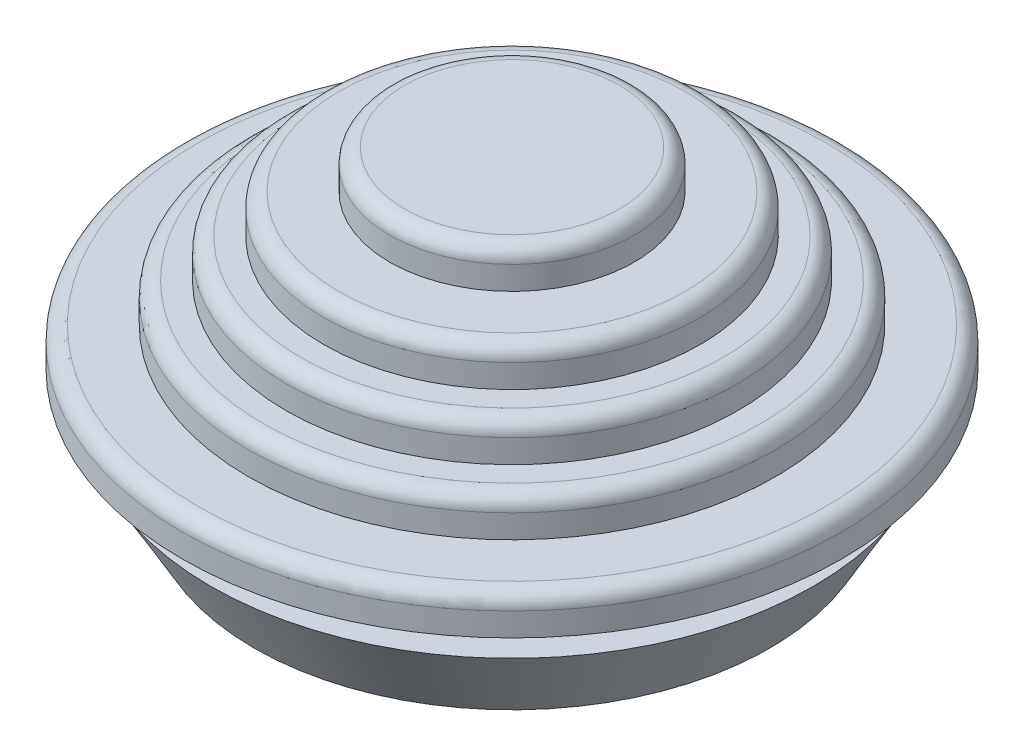
ISO-10303-21;
HEADER;
FILE_DESCRIPTION(('STEP AP214'),'2;1');
FILE_NAME('part.step','',(''),(''),'','','');
FILE_SCHEMA(('AUTOMOTIVE_DESIGN { 1 0 10303 214 1 1 1 1 }'));
ENDSEC;
DATA;
#1=APPLICATION_CONTEXT('core data for automotive mechanical design processes');
#2=APPLICATION_PROTOCOL_DEFINITION('international standard','automotive_design',2000,#1);
#3=PRODUCT_CONTEXT('',#1,'mechanical');
#4=PRODUCT('Part','Part','',(#3));
#5=PRODUCT_RELATED_PRODUCT_CATEGORY('part','',(#4));
#6=PRODUCT_DEFINITION_FORMATION('','',#4);
#7=PRODUCT_DEFINITION_CONTEXT('part definition',#1,'design');
#8=PRODUCT_DEFINITION('design','',#6,#7);
#9=PRODUCT_DEFINITION_SHAPE('','',#8);
#10=(LENGTH_UNIT() NAMED_UNIT(*) SI_UNIT(.MILLI.,.METRE.));
#11=(NAMED_UNIT(*) PLANE_ANGLE_UNIT() SI_UNIT($,.RADIAN.));
#12=(NAMED_UNIT(*) SI_UNIT($,.STERADIAN.) SOLID_ANGLE_UNIT());
#13=UNCERTAINTY_MEASURE_WITH_UNIT(LENGTH_MEASURE(1.E-05),#10,'distance_accuracy_value','');
#14=(GEOMETRIC_REPRESENTATION_CONTEXT(3) GLOBAL_UNCERTAINTY_ASSIGNED_CONTEXT((#13)) GLOBAL_UNIT_ASSIGNED_CONTEXT((#10,
#11,#12)) REPRESENTATION_CONTEXT('',''));
#15=CARTESIAN_POINT('',(0.,0.,0.));
#16=DIRECTION('',(0.,0.,1.));
#17=DIRECTION('',(1.,0.,0.));
#18=AXIS2_PLACEMENT_3D('',#15,#16,#17);
#19=CARTESIAN_POINT('',(0.,67.946967248786,0.));
#20=DIRECTION('',(0.,1.,0.));
#21=DIRECTION('',(0.,0.,1.));
#22=AXIS2_PLACEMENT_3D('',#19,#20,#21);
#23=CYLINDRICAL_SURFACE('',#22,12.4);
#24=CARTESIAN_POINT('',(0.,0.,0.));
#25=DIRECTION('',(0.,1.,0.));
#26=DIRECTION('',(0.,0.,1.));
#27=AXIS2_PLACEMENT_3D('',#24,#25,#26);
#28=CIRCLE('',#27,12.4);
#29=CARTESIAN_POINT('',(0.,0.,12.4));
#30=VERTEX_POINT('',#29);
#31=EDGE_CURVE('E113',#30,#30,#28,.T.);
#32=ORIENTED_EDGE('',*,*,#31,.F.);
#33=EDGE_LOOP('',(#32));
#34=FACE_BOUND('',#33,.T.);
#35=CARTESIAN_POINT('',(0.,8.08,0.));
#36=DIRECTION('',(0.,1.,0.));
#37=DIRECTION('',(0.,0.,1.));
#38=AXIS2_PLACEMENT_3D('',#35,#36,#37);
#39=CIRCLE('',#38,12.4);
#40=CARTESIAN_POINT('',(0.,8.08,12.4));
#41=VERTEX_POINT('',#40);
#42=EDGE_CURVE('E71',#41,#41,#39,.T.);
#43=ORIENTED_EDGE('',*,*,#42,.T.);
#44=EDGE_LOOP('',(#43));
#45=FACE_BOUND('',#44,.T.);
#46=ADVANCED_FACE('F33',(#34,#45),#23,.F.);
#47=CARTESIAN_POINT('',(10.,8.08,0.));
#48=DIRECTION('',(0.,1.,0.));
#49=DIRECTION('',(0.,0.,1.));
#50=AXIS2_PLACEMENT_3D('',#47,#48,#49);
#51=PLANE('',#50);
#52=ORIENTED_EDGE('',*,*,#42,.F.);
#53=EDGE_LOOP('',(#52));
#54=FACE_BOUND('',#53,.T.);
#55=CARTESIAN_POINT('',(0.,8.08,0.));
#56=DIRECTION('',(0.,1.,0.));
#57=DIRECTION('',(0.,0.,1.));
#58=AXIS2_PLACEMENT_3D('',#55,#56,#57);
#59=CIRCLE('',#58,10.);
#60=CARTESIAN_POINT('',(0.,8.08,10.));
#61=VERTEX_POINT('',#60);
#62=EDGE_CURVE('E74',#61,#61,#59,.T.);
#63=ORIENTED_EDGE('',*,*,#62,.T.);
#64=EDGE_LOOP('',(#63));
#65=FACE_BOUND('',#64,.T.);
#66=ADVANCED_FACE('F121',(#54,#65),#51,.F.);
#67=CARTESIAN_POINT('',(0.,67.946967248786,0.));
#68=DIRECTION('',(0.,1.,0.));
#69=DIRECTION('',(0.,0.,1.));
#70=AXIS2_PLACEMENT_3D('',#67,#68,#69);
#71=CYLINDRICAL_SURFACE('',#70,10.);
#72=ORIENTED_EDGE('',*,*,#62,.F.);
#73=EDGE_LOOP('',(#72));
#74=FACE_BOUND('',#73,.T.);
#75=CARTESIAN_POINT('',(0.,10.12,0.));
#76=DIRECTION('',(0.,1.,0.));
#77=DIRECTION('',(0.,0.,1.));
#78=AXIS2_PLACEMENT_3D('',#75,#76,#77);
#79=CIRCLE('',#78,10.);
#80=CARTESIAN_POINT('',(0.,10.12,10.));
#81=VERTEX_POINT('',#80);
#82=EDGE_CURVE('E77',#81,#81,#79,.T.);
#83=ORIENTED_EDGE('',*,*,#82,.T.);
#84=EDGE_LOOP('',(#83));
#85=FACE_BOUND('',#84,.T.);
#86=ADVANCED_FACE('F127',(#74,#85),#71,.F.);
#87=CARTESIAN_POINT('',(10.,10.12,0.));
#88=DIRECTION('',(0.,1.,0.));
#89=DIRECTION('',(0.,0.,1.));
#90=AXIS2_PLACEMENT_3D('',#87,#88,#89);
#91=PLANE('',#90);
#92=ORIENTED_EDGE('',*,*,#82,.F.);
#93=EDGE_LOOP('',(#92));
#94=FACE_BOUND('',#93,.T.);
#95=CARTESIAN_POINT('',(0.,10.12,0.));
#96=DIRECTION('',(0.,1.,0.));
#97=DIRECTION('',(0.,0.,1.));
#98=AXIS2_PLACEMENT_3D('',#95,#96,#97);
#99=CIRCLE('',#98,8.);
#100=CARTESIAN_POINT('',(0.,10.12,8.));
#101=VERTEX_POINT('',#100);
#102=EDGE_CURVE('E80',#101,#101,#99,.T.);
#103=ORIENTED_EDGE('',*,*,#102,.T.);
#104=EDGE_LOOP('',(#103));
#105=FACE_BOUND('',#104,.T.);
#106=ADVANCED_FACE('F133',(#94,#105),#91,.F.);
#107=CARTESIAN_POINT('',(0.,67.946967248786,0.));
#108=DIRECTION('',(0.,1.,0.));
#109=DIRECTION('',(0.,0.,1.));
#110=AXIS2_PLACEMENT_3D('',#107,#108,#109);
#111=CYLINDRICAL_SURFACE('',#110,8.);
#112=ORIENTED_EDGE('',*,*,#102,.F.);
#113=EDGE_LOOP('',(#112));
#114=FACE_BOUND('',#113,.T.);
#115=CARTESIAN_POINT('',(0.,12.16,0.));
#116=DIRECTION('',(0.,1.,0.));
#117=DIRECTION('',(0.,0.,1.));
#118=AXIS2_PLACEMENT_3D('',#115,#116,#117);
#119=CIRCLE('',#118,8.);
#120=CARTESIAN_POINT('',(0.,12.16,8.));
#121=VERTEX_POINT('',#120);
#122=EDGE_CURVE('E83',#121,#121,#119,.T.);
#123=ORIENTED_EDGE('',*,*,#122,.T.);
#124=EDGE_LOOP('',(#123));
#125=FACE_BOUND('',#124,.T.);
#126=ADVANCED_FACE('F139',(#114,#125),#111,.F.);
#127=CARTESIAN_POINT('',(8.,12.16,0.));
#128=DIRECTION('',(0.,1.,0.));
#129=DIRECTION('',(0.,0.,1.));
#130=AXIS2_PLACEMENT_3D('',#127,#128,#129);
#131=PLANE('',#130);
#132=ORIENTED_EDGE('',*,*,#122,.F.);
#133=EDGE_LOOP('',(#132));
#134=FACE_BOUND('',#133,.T.);
#135=ADVANCED_FACE('F145',(#134),#131,.F.);
#136=CARTESIAN_POINT('',(6.5,16.2,0.));
#137=DIRECTION('',(0.,-1.,0.));
#138=DIRECTION('',(0.,0.,-1.));
#139=AXIS2_PLACEMENT_3D('',#136,#137,#138);
#140=PLANE('',#139);
#141=CARTESIAN_POINT('',(0.,16.2,0.));
#142=DIRECTION('',(0.,-1.,0.));
#143=DIRECTION('',(0.,0.,-1.));
#144=AXIS2_PLACEMENT_3D('',#141,#142,#143);
#145=CIRCLE('',#144,5.7);
#146=CARTESIAN_POINT('',(0.,16.2,-5.7));
#147=VERTEX_POINT('',#146);
#148=EDGE_CURVE('E68',#147,#147,#145,.F.);
#149=ORIENTED_EDGE('',*,*,#148,.T.);
#150=EDGE_LOOP('',(#149));
#151=FACE_BOUND('',#150,.T.);
#152=ADVANCED_FACE('F150',(#151),#140,.F.);
#153=CARTESIAN_POINT('',(0.,67.946967248786,0.));
#154=DIRECTION('',(0.,1.,0.));
#155=DIRECTION('',(0.,0.,1.));
#156=AXIS2_PLACEMENT_3D('',#153,#154,#155);
#157=CYLINDRICAL_SURFACE('',#156,6.5);
#158=CARTESIAN_POINT('',(0.,15.4,0.));
#159=DIRECTION('',(0.,-1.,0.));
#160=DIRECTION('',(0.,0.,-1.));
#161=AXIS2_PLACEMENT_3D('',#158,#159,#160);
#162=CIRCLE('',#161,6.5);
#163=CARTESIAN_POINT('',(0.,15.4,-6.5));
#164=VERTEX_POINT('',#163);
#165=EDGE_CURVE('E65',#164,#164,#162,.T.);
#166=ORIENTED_EDGE('',*,*,#165,.T.);
#167=EDGE_LOOP('',(#166));
#168=FACE_BOUND('',#167,.T.);
#169=CARTESIAN_POINT('',(0.,14.16,0.));
#170=DIRECTION('',(0.,1.,0.));
#171=DIRECTION('',(0.,0.,1.));
#172=AXIS2_PLACEMENT_3D('',#169,#170,#171);
#173=CIRCLE('',#172,6.5);
#174=CARTESIAN_POINT('',(0.,14.16,6.5));
#175=VERTEX_POINT('',#174);
#176=EDGE_CURVE('E86',#175,#175,#173,.T.);
#177=ORIENTED_EDGE('',*,*,#176,.T.);
#178=EDGE_LOOP('',(#177));
#179=FACE_BOUND('',#178,.T.);
#180=ADVANCED_FACE('F155',(#168,#179),#157,.T.);
#181=CARTESIAN_POINT('',(10.,14.16,0.));
#182=DIRECTION('',(0.,-1.,0.));
#183=DIRECTION('',(0.,0.,-1.));
#184=AXIS2_PLACEMENT_3D('',#181,#182,#183);
#185=PLANE('',#184);
#186=CARTESIAN_POINT('',(0.,14.16,0.));
#187=DIRECTION('',(0.,-1.,0.));
#188=DIRECTION('',(0.,0.,-1.));
#189=AXIS2_PLACEMENT_3D('',#186,#187,#188);
#190=CIRCLE('',#189,9.2);
#191=CARTESIAN_POINT('',(0.,14.16,-9.2));
#192=VERTEX_POINT('',#191);
#193=EDGE_CURVE('E62',#192,#192,#190,.F.);
#194=ORIENTED_EDGE('',*,*,#193,.T.);
#195=EDGE_LOOP('',(#194));
#196=FACE_BOUND('',#195,.T.);
#197=ORIENTED_EDGE('',*,*,#176,.F.);
#198=EDGE_LOOP('',(#197));
#199=FACE_BOUND('',#198,.T.);
#200=ADVANCED_FACE('F204',(#196,#199),#185,.F.);
#201=CARTESIAN_POINT('',(0.,67.946967248786,0.));
#202=DIRECTION('',(0.,1.,0.));
#203=DIRECTION('',(0.,0.,1.));
#204=AXIS2_PLACEMENT_3D('',#201,#202,#203);
#205=CYLINDRICAL_SURFACE('',#204,10.);
#206=CARTESIAN_POINT('',(0.,13.36,0.));
#207=DIRECTION('',(0.,-1.,0.));
#208=DIRECTION('',(0.,0.,-1.));
#209=AXIS2_PLACEMENT_3D('',#206,#207,#208);
#210=CIRCLE('',#209,10.);
#211=CARTESIAN_POINT('',(0.,13.36,-10.));
#212=VERTEX_POINT('',#211);
#213=EDGE_CURVE('E59',#212,#212,#210,.T.);
#214=ORIENTED_EDGE('',*,*,#213,.T.);
#215=EDGE_LOOP('',(#214));
#216=FACE_BOUND('',#215,.T.);
#217=CARTESIAN_POINT('',(0.,12.12,0.));
#218=DIRECTION('',(0.,1.,0.));
#219=DIRECTION('',(0.,0.,1.));
#220=AXIS2_PLACEMENT_3D('',#217,#218,#219);
#221=CIRCLE('',#220,10.);
#222=CARTESIAN_POINT('',(0.,12.12,10.));
#223=VERTEX_POINT('',#222);
#224=EDGE_CURVE('E89',#223,#223,#221,.T.);
#225=ORIENTED_EDGE('',*,*,#224,.T.);
#226=EDGE_LOOP('',(#225));
#227=FACE_BOUND('',#226,.T.);
#228=ADVANCED_FACE('F197',(#216,#227),#205,.T.);
#229=CARTESIAN_POINT('',(12.,12.12,0.));
#230=DIRECTION('',(0.,-1.,0.));
#231=DIRECTION('',(0.,0.,-1.));
#232=AXIS2_PLACEMENT_3D('',#229,#230,#231);
#233=PLANE('',#232);
#234=CARTESIAN_POINT('',(0.,12.12,0.));
#235=DIRECTION('',(0.,-1.,0.));
#236=DIRECTION('',(0.,0.,-1.));
#237=AXIS2_PLACEMENT_3D('',#234,#235,#236);
#238=CIRCLE('',#237,11.2);
#239=CARTESIAN_POINT('',(0.,12.12,-11.2));
#240=VERTEX_POINT('',#239);
#241=EDGE_CURVE('E56',#240,#240,#238,.F.);
#242=ORIENTED_EDGE('',*,*,#241,.T.);
#243=EDGE_LOOP('',(#242));
#244=FACE_BOUND('',#243,.T.);
#245=ORIENTED_EDGE('',*,*,#224,.F.);
#246=EDGE_LOOP('',(#245));
#247=FACE_BOUND('',#246,.T.);
#248=ADVANCED_FACE('F191',(#244,#247),#233,.F.);
#249=CARTESIAN_POINT('',(0.,67.946967248786,0.));
#250=DIRECTION('',(0.,1.,0.));
#251=DIRECTION('',(0.,0.,1.));
#252=AXIS2_PLACEMENT_3D('',#249,#250,#251);
#253=CYLINDRICAL_SURFACE('',#252,12.);
#254=CARTESIAN_POINT('',(0.,11.32,0.));
#255=DIRECTION('',(0.,-1.,0.));
#256=DIRECTION('',(0.,0.,-1.));
#257=AXIS2_PLACEMENT_3D('',#254,#255,#256);
#258=CIRCLE('',#257,12.);
#259=CARTESIAN_POINT('',(0.,11.32,-12.));
#260=VERTEX_POINT('',#259);
#261=EDGE_CURVE('E53',#260,#260,#258,.T.);
#262=ORIENTED_EDGE('',*,*,#261,.T.);
#263=EDGE_LOOP('',(#262));
#264=FACE_BOUND('',#263,.T.);
#265=CARTESIAN_POINT('',(0.,10.08,0.));
#266=DIRECTION('',(0.,1.,0.));
#267=DIRECTION('',(0.,0.,1.));
#268=AXIS2_PLACEMENT_3D('',#265,#266,#267);
#269=CIRCLE('',#268,12.);
#270=CARTESIAN_POINT('',(0.,10.08,12.));
#271=VERTEX_POINT('',#270);
#272=EDGE_CURVE('E92',#271,#271,#269,.T.);
#273=ORIENTED_EDGE('',*,*,#272,.T.);
#274=EDGE_LOOP('',(#273));
#275=FACE_BOUND('',#274,.T.);
#276=ADVANCED_FACE('F186',(#264,#275),#253,.T.);
#277=CARTESIAN_POINT('',(14.,10.08,0.));
#278=DIRECTION('',(0.,-1.,0.));
#279=DIRECTION('',(0.,0.,-1.));
#280=AXIS2_PLACEMENT_3D('',#277,#278,#279);
#281=PLANE('',#280);
#282=CARTESIAN_POINT('',(0.,10.08,0.));
#283=DIRECTION('',(0.,-1.,0.));
#284=DIRECTION('',(0.,0.,-1.));
#285=AXIS2_PLACEMENT_3D('',#282,#283,#284);
#286=CIRCLE('',#285,13.2);
#287=CARTESIAN_POINT('',(0.,10.08,-13.2));
#288=VERTEX_POINT('',#287);
#289=EDGE_CURVE('E48',#288,#288,#286,.F.);
#290=ORIENTED_EDGE('',*,*,#289,.T.);
#291=EDGE_LOOP('',(#290));
#292=FACE_BOUND('',#291,.T.);
#293=ORIENTED_EDGE('',*,*,#272,.F.);
#294=EDGE_LOOP('',(#293));
#295=FACE_BOUND('',#294,.T.);
#296=ADVANCED_FACE('F182',(#292,#295),#281,.F.);
#297=CARTESIAN_POINT('',(0.,67.946967248786,0.));
#298=DIRECTION('',(0.,1.,0.));
#299=DIRECTION('',(0.,0.,1.));
#300=AXIS2_PLACEMENT_3D('',#297,#298,#299);
#301=CYLINDRICAL_SURFACE('',#300,14.);
#302=CARTESIAN_POINT('',(0.,9.28,0.));
#303=DIRECTION('',(0.,-1.,0.));
#304=DIRECTION('',(0.,0.,-1.));
#305=AXIS2_PLACEMENT_3D('',#302,#303,#304);
#306=CIRCLE('',#305,14.);
#307=CARTESIAN_POINT('',(0.,9.28,-14.));
#308=VERTEX_POINT('',#307);
#309=EDGE_CURVE('E44',#308,#308,#306,.T.);
#310=ORIENTED_EDGE('',*,*,#309,.T.);
#311=EDGE_LOOP('',(#310));
#312=FACE_BOUND('',#311,.T.);
#313=CARTESIAN_POINT('',(0.,8.04,0.));
#314=DIRECTION('',(0.,1.,0.));
#315=DIRECTION('',(0.,0.,1.));
#316=AXIS2_PLACEMENT_3D('',#313,#314,#315);
#317=CIRCLE('',#316,14.);
#318=CARTESIAN_POINT('',(0.,8.04,14.));
#319=VERTEX_POINT('',#318);
#320=EDGE_CURVE('E95',#319,#319,#317,.T.);
#321=ORIENTED_EDGE('',*,*,#320,.T.);
#322=EDGE_LOOP('',(#321));
#323=FACE_BOUND('',#322,.T.);
#324=ADVANCED_FACE('F185',(#312,#323),#301,.T.);
#325=CARTESIAN_POINT('',(17.5,8.04,0.));
#326=DIRECTION('',(0.,-1.,0.));
#327=DIRECTION('',(0.,0.,-1.));
#328=AXIS2_PLACEMENT_3D('',#325,#326,#327);
#329=PLANE('',#328);
#330=CARTESIAN_POINT('',(0.,8.04,0.));
#331=DIRECTION('',(0.,-1.,0.));
#332=DIRECTION('',(0.,0.,-1.));
#333=AXIS2_PLACEMENT_3D('',#330,#331,#332);
#334=CIRCLE('',#333,16.7);
#335=CARTESIAN_POINT('',(0.,8.04,-16.7));
#336=VERTEX_POINT('',#335);
#337=EDGE_CURVE('E40',#336,#336,#334,.F.);
#338=ORIENTED_EDGE('',*,*,#337,.T.);
#339=EDGE_LOOP('',(#338));
#340=FACE_BOUND('',#339,.T.);
#341=ORIENTED_EDGE('',*,*,#320,.F.);
#342=EDGE_LOOP('',(#341));
#343=FACE_BOUND('',#342,.T.);
#344=ADVANCED_FACE('F251',(#340,#343),#329,.F.);
#345=CARTESIAN_POINT('',(0.,67.946967248786,0.));
#346=DIRECTION('',(0.,1.,0.));
#347=DIRECTION('',(0.,0.,1.));
#348=AXIS2_PLACEMENT_3D('',#345,#346,#347);
#349=CYLINDRICAL_SURFACE('',#348,17.5);
#350=CARTESIAN_POINT('',(0.,7.24,0.));
#351=DIRECTION('',(0.,-1.,0.));
#352=DIRECTION('',(0.,0.,-1.));
#353=AXIS2_PLACEMENT_3D('',#350,#351,#352);
#354=CIRCLE('',#353,17.5);
#355=CARTESIAN_POINT('',(0.,7.24,-17.5));
#356=VERTEX_POINT('',#355);
#357=EDGE_CURVE('E10',#356,#356,#354,.T.);
#358=ORIENTED_EDGE('',*,*,#357,.T.);
#359=EDGE_LOOP('',(#358));
#360=FACE_BOUND('',#359,.T.);
#361=CARTESIAN_POINT('',(0.,6.,0.));
#362=DIRECTION('',(0.,1.,0.));
#363=DIRECTION('',(0.,0.,1.));
#364=AXIS2_PLACEMENT_3D('',#361,#362,#363);
#365=CIRCLE('',#364,17.5);
#366=CARTESIAN_POINT('',(0.,6.,17.5));
#367=VERTEX_POINT('',#366);
#368=EDGE_CURVE('E98',#367,#367,#365,.T.);
#369=ORIENTED_EDGE('',*,*,#368,.T.);
#370=EDGE_LOOP('',(#369));
#371=FACE_BOUND('',#370,.T.);
#372=ADVANCED_FACE('F260',(#360,#371),#349,.T.);
#373=CARTESIAN_POINT('',(14.5,6.,0.));
#374=DIRECTION('',(0.,1.,0.));
#375=DIRECTION('',(0.,0.,1.));
#376=AXIS2_PLACEMENT_3D('',#373,#374,#375);
#377=PLANE('',#376);
#378=ORIENTED_EDGE('',*,*,#368,.F.);
#379=EDGE_LOOP('',(#378));
#380=FACE_BOUND('',#379,.T.);
#381=CARTESIAN_POINT('',(0.,6.,0.));
#382=DIRECTION('',(0.,1.,0.));
#383=DIRECTION('',(0.,0.,1.));
#384=AXIS2_PLACEMENT_3D('',#381,#382,#383);
#385=CIRCLE('',#384,14.5);
#386=CARTESIAN_POINT('',(0.,6.,14.5));
#387=VERTEX_POINT('',#386);
#388=EDGE_CURVE('E101',#387,#387,#385,.T.);
#389=ORIENTED_EDGE('',*,*,#388,.T.);
#390=EDGE_LOOP('',(#389));
#391=FACE_BOUND('',#390,.T.);
#392=ADVANCED_FACE('F269',(#380,#391),#377,.F.);
#393=CARTESIAN_POINT('',(0.,67.946967248786,0.));
#394=DIRECTION('',(0.,1.,0.));
#395=DIRECTION('',(0.,0.,1.));
#396=AXIS2_PLACEMENT_3D('',#393,#394,#395);
#397=CYLINDRICAL_SURFACE('',#396,14.5);
#398=ORIENTED_EDGE('',*,*,#388,.F.);
#399=EDGE_LOOP('',(#398));
#400=FACE_BOUND('',#399,.T.);
#401=CARTESIAN_POINT('',(0.,3.99999999999999,0.));
#402=DIRECTION('',(0.,1.,0.));
#403=DIRECTION('',(0.,0.,1.));
#404=AXIS2_PLACEMENT_3D('',#401,#402,#403);
#405=CIRCLE('',#404,14.5);
#406=CARTESIAN_POINT('',(0.,3.99999999999999,14.5));
#407=VERTEX_POINT('',#406);
#408=EDGE_CURVE('E104',#407,#407,#405,.T.);
#409=ORIENTED_EDGE('',*,*,#408,.T.);
#410=EDGE_LOOP('',(#409));
#411=FACE_BOUND('',#410,.T.);
#412=ADVANCED_FACE('F323',(#400,#411),#397,.T.);
#413=CARTESIAN_POINT('',(16.,4.,0.));
#414=DIRECTION('',(0.,-1.,0.));
#415=DIRECTION('',(0.,0.,-1.));
#416=AXIS2_PLACEMENT_3D('',#413,#414,#415);
#417=PLANE('',#416);
#418=ORIENTED_EDGE('',*,*,#408,.F.);
#419=EDGE_LOOP('',(#418));
#420=FACE_BOUND('',#419,.T.);
#421=CARTESIAN_POINT('',(0.,4.,0.));
#422=DIRECTION('',(0.,1.,0.));
#423=DIRECTION('',(0.,0.,1.));
#424=AXIS2_PLACEMENT_3D('',#421,#422,#423);
#425=CIRCLE('',#424,16.);
#426=CARTESIAN_POINT('',(0.,4.,16.));
#427=VERTEX_POINT('',#426);
#428=EDGE_CURVE('E107',#427,#427,#425,.T.);
#429=ORIENTED_EDGE('',*,*,#428,.T.);
#430=EDGE_LOOP('',(#429));
#431=FACE_BOUND('',#430,.T.);
#432=ADVANCED_FACE('F315',(#420,#431),#417,.F.);
#433=CARTESIAN_POINT('',(0.,0.,0.));
#434=DIRECTION('',(0.,1.,0.));
#435=DIRECTION('',(0.,0.,1.));
#436=AXIS2_PLACEMENT_3D('',#433,#434,#435);
#437=CONICAL_SURFACE('',#436,13.6905989232416,0.523598775598289);
#438=ORIENTED_EDGE('',*,*,#428,.F.);
#439=EDGE_LOOP('',(#438));
#440=FACE_BOUND('',#439,.T.);
#441=CARTESIAN_POINT('',(0.,0.,0.));
#442=DIRECTION('',(0.,1.,0.));
#443=DIRECTION('',(0.,0.,1.));
#444=AXIS2_PLACEMENT_3D('',#441,#442,#443);
#445=CIRCLE('',#444,13.6905989232416);
#446=CARTESIAN_POINT('',(0.,0.,13.6905989232416));
#447=VERTEX_POINT('',#446);
#448=EDGE_CURVE('E110',#447,#447,#445,.T.);
#449=ORIENTED_EDGE('',*,*,#448,.T.);
#450=EDGE_LOOP('',(#449));
#451=FACE_BOUND('',#450,.T.);
#452=ADVANCED_FACE('F308',(#440,#451),#437,.T.);
#453=CARTESIAN_POINT('',(12.4,0.,0.));
#454=DIRECTION('',(0.,1.,0.));
#455=DIRECTION('',(0.,0.,1.));
#456=AXIS2_PLACEMENT_3D('',#453,#454,#455);
#457=PLANE('',#456);
#458=ORIENTED_EDGE('',*,*,#448,.F.);
#459=EDGE_LOOP('',(#458));
#460=FACE_BOUND('',#459,.T.);
#461=ORIENTED_EDGE('',*,*,#31,.T.);
#462=EDGE_LOOP('',(#461));
#463=FACE_BOUND('',#462,.T.);
#464=ADVANCED_FACE('F117',(#460,#463),#457,.F.);
#465=CARTESIAN_POINT('',(0.,15.4,0.));
#466=DIRECTION('',(0.,-1.,0.));
#467=DIRECTION('',(0.,0.,-1.));
#468=AXIS2_PLACEMENT_3D('',#465,#466,#467);
#469=TOROIDAL_SURFACE('',#468,5.7,0.8);
#470=ORIENTED_EDGE('',*,*,#165,.F.);
#471=EDGE_LOOP('',(#470));
#472=FACE_BOUND('',#471,.T.);
#473=ORIENTED_EDGE('',*,*,#148,.F.);
#474=EDGE_LOOP('',(#473));
#475=FACE_BOUND('',#474,.T.);
#476=ADVANCED_FACE('F160',(#472,#475),#469,.T.);
#477=CARTESIAN_POINT('',(0.,13.36,0.));
#478=DIRECTION('',(0.,-1.,0.));
#479=DIRECTION('',(0.,0.,-1.));
#480=AXIS2_PLACEMENT_3D('',#477,#478,#479);
#481=TOROIDAL_SURFACE('',#480,9.2,0.8);
#482=ORIENTED_EDGE('',*,*,#213,.F.);
#483=EDGE_LOOP('',(#482));
#484=FACE_BOUND('',#483,.T.);
#485=ORIENTED_EDGE('',*,*,#193,.F.);
#486=EDGE_LOOP('',(#485));
#487=FACE_BOUND('',#486,.T.);
#488=ADVANCED_FACE('F163',(#484,#487),#481,.T.);
#489=CARTESIAN_POINT('',(0.,11.32,0.));
#490=DIRECTION('',(0.,-1.,0.));
#491=DIRECTION('',(0.,0.,-1.));
#492=AXIS2_PLACEMENT_3D('',#489,#490,#491);
#493=TOROIDAL_SURFACE('',#492,11.2,0.8);
#494=ORIENTED_EDGE('',*,*,#261,.F.);
#495=EDGE_LOOP('',(#494));
#496=FACE_BOUND('',#495,.T.);
#497=ORIENTED_EDGE('',*,*,#241,.F.);
#498=EDGE_LOOP('',(#497));
#499=FACE_BOUND('',#498,.T.);
#500=ADVANCED_FACE('F167',(#496,#499),#493,.T.);
#501=CARTESIAN_POINT('',(0.,9.28,0.));
#502=DIRECTION('',(0.,-1.,0.));
#503=DIRECTION('',(0.,0.,-1.));
#504=AXIS2_PLACEMENT_3D('',#501,#502,#503);
#505=TOROIDAL_SURFACE('',#504,13.2,0.8);
#506=ORIENTED_EDGE('',*,*,#309,.F.);
#507=EDGE_LOOP('',(#506));
#508=FACE_BOUND('',#507,.T.);
#509=ORIENTED_EDGE('',*,*,#289,.F.);
#510=EDGE_LOOP('',(#509));
#511=FACE_BOUND('',#510,.T.);
#512=ADVANCED_FACE('F170',(#508,#511),#505,.T.);
#513=CARTESIAN_POINT('',(0.,7.24,0.));
#514=DIRECTION('',(0.,-1.,0.));
#515=DIRECTION('',(0.,0.,-1.));
#516=AXIS2_PLACEMENT_3D('',#513,#514,#515);
#517=TOROIDAL_SURFACE('',#516,16.7,0.8);
#518=ORIENTED_EDGE('',*,*,#357,.F.);
#519=EDGE_LOOP('',(#518));
#520=FACE_BOUND('',#519,.T.);
#521=ORIENTED_EDGE('',*,*,#337,.F.);
#522=EDGE_LOOP('',(#521));
#523=FACE_BOUND('',#522,.T.);
#524=ADVANCED_FACE('F35',(#520,#523),#517,.T.);
#525=CLOSED_SHELL('',(#46,#66,#86,#106,#126,#135,#152,#180,#200,#228,#248,#276,#296,#324,#344,
#372,#392,#412,#432,#452,#464,#476,#488,#500,#512,#524));
#526=MANIFOLD_SOLID_BREP('B2',#525);
#527=ADVANCED_BREP_SHAPE_REPRESENTATION('',(#18,#526),#14);
#528=SHAPE_DEFINITION_REPRESENTATION(#9,#527);
ENDSEC;
END-ISO-10303-21;
